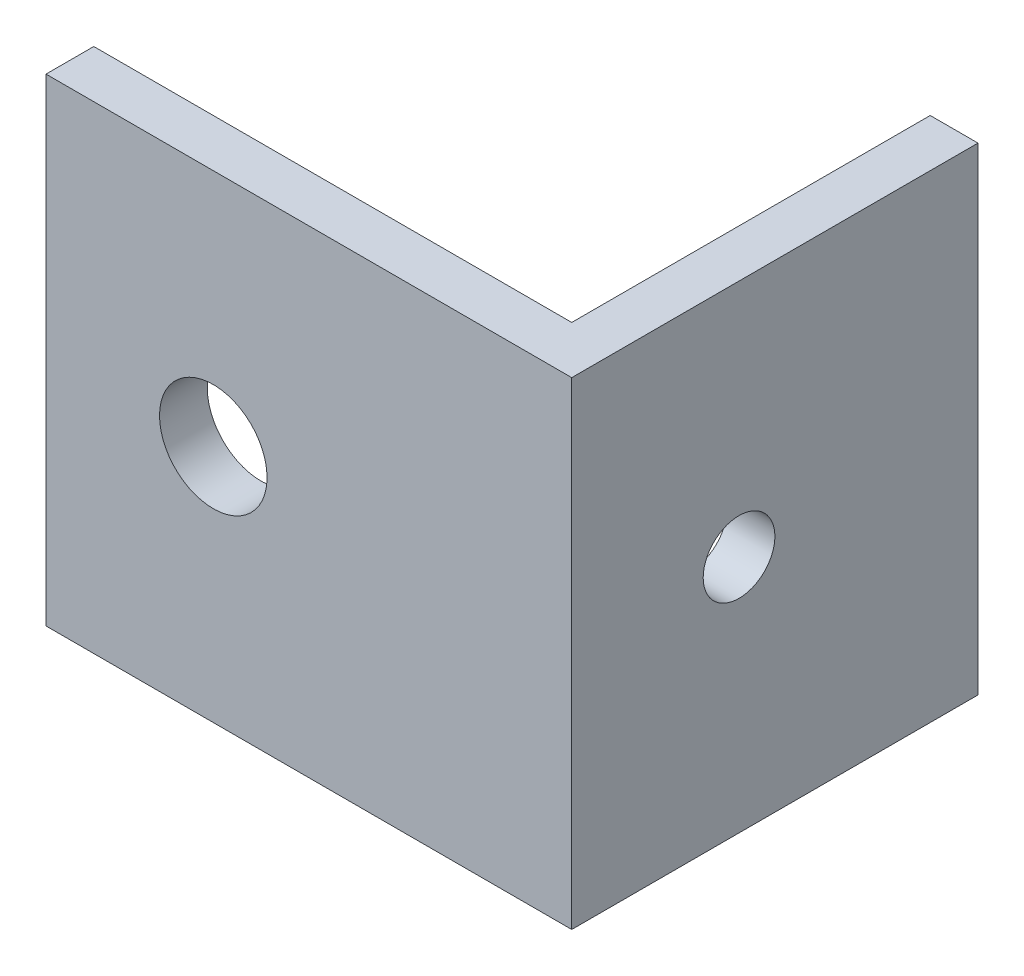
ISO-10303-21;
HEADER;
FILE_DESCRIPTION(('STEP AP214'),'2;1');
FILE_NAME('part.step','',(''),(''),'','','');
FILE_SCHEMA(('AUTOMOTIVE_DESIGN { 1 0 10303 214 1 1 1 1 }'));
ENDSEC;
DATA;
#1=APPLICATION_CONTEXT('core data for automotive mechanical design processes');
#2=APPLICATION_PROTOCOL_DEFINITION('international standard','automotive_design',2000,#1);
#3=PRODUCT_CONTEXT('',#1,'mechanical');
#4=PRODUCT('Part','Part','',(#3));
#5=PRODUCT_RELATED_PRODUCT_CATEGORY('part','',(#4));
#6=PRODUCT_DEFINITION_FORMATION('','',#4);
#7=PRODUCT_DEFINITION_CONTEXT('part definition',#1,'design');
#8=PRODUCT_DEFINITION('design','',#6,#7);
#9=PRODUCT_DEFINITION_SHAPE('','',#8);
#10=(LENGTH_UNIT() NAMED_UNIT(*) SI_UNIT(.MILLI.,.METRE.));
#11=(NAMED_UNIT(*) PLANE_ANGLE_UNIT() SI_UNIT($,.RADIAN.));
#12=(NAMED_UNIT(*) SI_UNIT($,.STERADIAN.) SOLID_ANGLE_UNIT());
#13=UNCERTAINTY_MEASURE_WITH_UNIT(LENGTH_MEASURE(1.E-05),#10,'distance_accuracy_value','');
#14=(GEOMETRIC_REPRESENTATION_CONTEXT(3) GLOBAL_UNCERTAINTY_ASSIGNED_CONTEXT((#13)) GLOBAL_UNIT_ASSIGNED_CONTEXT((#10,
#11,#12)) REPRESENTATION_CONTEXT('',''));
#15=CARTESIAN_POINT('',(0.,0.,0.));
#16=DIRECTION('',(0.,0.,1.));
#17=DIRECTION('',(1.,0.,0.));
#18=AXIS2_PLACEMENT_3D('',#15,#16,#17);
#19=CARTESIAN_POINT('',(-20.,20.,0.));
#20=DIRECTION('',(1.,0.,0.));
#21=DIRECTION('',(0.,0.,-1.));
#22=AXIS2_PLACEMENT_3D('',#19,#20,#21);
#23=PLANE('',#22);
#24=DIRECTION('',(0.,0.,1.));
#25=VECTOR('',#24,1.);
#26=CARTESIAN_POINT('',(-20.,0.,0.));
#27=LINE('',#26,#25);
#28=CARTESIAN_POINT('',(-20.,0.,0.));
#29=VERTEX_POINT('',#28);
#30=CARTESIAN_POINT('',(-20.,0.,2.));
#31=VERTEX_POINT('',#30);
#32=EDGE_CURVE('E119',#29,#31,#27,.T.);
#33=ORIENTED_EDGE('',*,*,#32,.T.);
#34=DIRECTION('',(0.,-1.,0.));
#35=VECTOR('',#34,1.);
#36=CARTESIAN_POINT('',(-20.,20.,2.));
#37=LINE('',#36,#35);
#38=CARTESIAN_POINT('',(-20.,20.,2.));
#39=VERTEX_POINT('',#38);
#40=EDGE_CURVE('E11',#39,#31,#37,.T.);
#41=ORIENTED_EDGE('',*,*,#40,.F.);
#42=DIRECTION('',(0.,0.,1.));
#43=VECTOR('',#42,1.);
#44=CARTESIAN_POINT('',(-20.,20.,0.));
#45=LINE('',#44,#43);
#46=CARTESIAN_POINT('',(-20.,20.,0.));
#47=VERTEX_POINT('',#46);
#48=EDGE_CURVE('E130',#47,#39,#45,.T.);
#49=ORIENTED_EDGE('',*,*,#48,.F.);
#50=DIRECTION('',(0.,-1.,0.));
#51=VECTOR('',#50,1.);
#52=CARTESIAN_POINT('',(-20.,20.,0.));
#53=LINE('',#52,#51);
#54=EDGE_CURVE('E115',#47,#29,#53,.T.);
#55=ORIENTED_EDGE('',*,*,#54,.T.);
#56=EDGE_LOOP('',(#33,#41,#49,#55));
#57=FACE_BOUND('',#56,.T.);
#58=ADVANCED_FACE('F35',(#57),#23,.F.);
#59=CARTESIAN_POINT('',(-20.,20.,2.));
#60=DIRECTION('',(0.,0.,-1.));
#61=DIRECTION('',(-1.,0.,0.));
#62=AXIS2_PLACEMENT_3D('',#59,#60,#61);
#63=PLANE('',#62);
#64=CARTESIAN_POINT('',(-13.,10.,2.));
#65=DIRECTION('',(0.,0.,-1.));
#66=DIRECTION('',(-1.,0.,0.));
#67=AXIS2_PLACEMENT_3D('',#64,#65,#66);
#68=CIRCLE('',#67,2.25);
#69=CARTESIAN_POINT('',(-15.25,10.,2.));
#70=VERTEX_POINT('',#69);
#71=EDGE_CURVE('E123',#70,#70,#68,.T.);
#72=ORIENTED_EDGE('',*,*,#71,.T.);
#73=EDGE_LOOP('',(#72));
#74=FACE_BOUND('',#73,.T.);
#75=DIRECTION('',(1.,0.,0.));
#76=VECTOR('',#75,1.);
#77=CARTESIAN_POINT('',(-20.,0.,2.));
#78=LINE('',#77,#76);
#79=CARTESIAN_POINT('',(2.,0.,2.));
#80=VERTEX_POINT('',#79);
#81=EDGE_CURVE('E122',#31,#80,#78,.T.);
#82=ORIENTED_EDGE('',*,*,#81,.T.);
#83=DIRECTION('',(0.,-1.,0.));
#84=VECTOR('',#83,1.);
#85=CARTESIAN_POINT('',(2.,20.,2.));
#86=LINE('',#85,#84);
#87=CARTESIAN_POINT('',(2.,20.,2.));
#88=VERTEX_POINT('',#87);
#89=EDGE_CURVE('E43',#88,#80,#86,.T.);
#90=ORIENTED_EDGE('',*,*,#89,.F.);
#91=DIRECTION('',(1.,0.,0.));
#92=VECTOR('',#91,1.);
#93=CARTESIAN_POINT('',(-20.,20.,2.));
#94=LINE('',#93,#92);
#95=EDGE_CURVE('E88',#39,#88,#94,.T.);
#96=ORIENTED_EDGE('',*,*,#95,.F.);
#97=ORIENTED_EDGE('',*,*,#40,.T.);
#98=EDGE_LOOP('',(#82,#90,#96,#97));
#99=FACE_BOUND('',#98,.T.);
#100=ADVANCED_FACE('F157',(#74,#99),#63,.F.);
#101=CARTESIAN_POINT('',(2.,20.,2.));
#102=DIRECTION('',(-1.,0.,0.));
#103=DIRECTION('',(0.,0.,1.));
#104=AXIS2_PLACEMENT_3D('',#101,#102,#103);
#105=PLANE('',#104);
#106=CARTESIAN_POINT('',(2.,10.,-5.));
#107=DIRECTION('',(-1.,0.,0.));
#108=DIRECTION('',(0.,0.,1.));
#109=AXIS2_PLACEMENT_3D('',#106,#107,#108);
#110=CIRCLE('',#109,1.5);
#111=CARTESIAN_POINT('',(2.,10.,-3.5));
#112=VERTEX_POINT('',#111);
#113=EDGE_CURVE('E237',#112,#112,#110,.T.);
#114=ORIENTED_EDGE('',*,*,#113,.T.);
#115=EDGE_LOOP('',(#114));
#116=FACE_BOUND('',#115,.T.);
#117=DIRECTION('',(0.,0.,-1.));
#118=VECTOR('',#117,1.);
#119=CARTESIAN_POINT('',(2.,0.,2.));
#120=LINE('',#119,#118);
#121=CARTESIAN_POINT('',(2.,0.,-15.));
#122=VERTEX_POINT('',#121);
#123=EDGE_CURVE('E125',#80,#122,#120,.T.);
#124=ORIENTED_EDGE('',*,*,#123,.T.);
#125=DIRECTION('',(0.,-1.,0.));
#126=VECTOR('',#125,1.);
#127=CARTESIAN_POINT('',(2.,20.,-15.));
#128=LINE('',#127,#126);
#129=CARTESIAN_POINT('',(2.,20.,-15.));
#130=VERTEX_POINT('',#129);
#131=EDGE_CURVE('E110',#130,#122,#128,.T.);
#132=ORIENTED_EDGE('',*,*,#131,.F.);
#133=DIRECTION('',(0.,0.,-1.));
#134=VECTOR('',#133,1.);
#135=CARTESIAN_POINT('',(2.,20.,2.));
#136=LINE('',#135,#134);
#137=EDGE_CURVE('E101',#88,#130,#136,.T.);
#138=ORIENTED_EDGE('',*,*,#137,.F.);
#139=ORIENTED_EDGE('',*,*,#89,.T.);
#140=EDGE_LOOP('',(#124,#132,#138,#139));
#141=FACE_BOUND('',#140,.T.);
#142=ADVANCED_FACE('F136',(#116,#141),#105,.F.);
#143=CARTESIAN_POINT('',(0.,20.,-15.));
#144=DIRECTION('',(0.,0.,1.));
#145=DIRECTION('',(1.,0.,0.));
#146=AXIS2_PLACEMENT_3D('',#143,#144,#145);
#147=PLANE('',#146);
#148=DIRECTION('',(-1.,0.,0.));
#149=VECTOR('',#148,1.);
#150=CARTESIAN_POINT('',(0.,0.,-15.));
#151=LINE('',#150,#149);
#152=CARTESIAN_POINT('',(0.,0.,-15.));
#153=VERTEX_POINT('',#152);
#154=EDGE_CURVE('E109',#122,#153,#151,.T.);
#155=ORIENTED_EDGE('',*,*,#154,.T.);
#156=DIRECTION('',(0.,-1.,0.));
#157=VECTOR('',#156,1.);
#158=CARTESIAN_POINT('',(0.,20.,-15.));
#159=LINE('',#158,#157);
#160=CARTESIAN_POINT('',(0.,20.,-15.));
#161=VERTEX_POINT('',#160);
#162=EDGE_CURVE('E106',#161,#153,#159,.T.);
#163=ORIENTED_EDGE('',*,*,#162,.F.);
#164=DIRECTION('',(-1.,0.,0.));
#165=VECTOR('',#164,1.);
#166=CARTESIAN_POINT('',(0.,20.,-15.));
#167=LINE('',#166,#165);
#168=EDGE_CURVE('E95',#130,#161,#167,.T.);
#169=ORIENTED_EDGE('',*,*,#168,.F.);
#170=ORIENTED_EDGE('',*,*,#131,.T.);
#171=EDGE_LOOP('',(#155,#163,#169,#170));
#172=FACE_BOUND('',#171,.T.);
#173=ADVANCED_FACE('F107',(#172),#147,.F.);
#174=CARTESIAN_POINT('',(0.,20.,0.));
#175=DIRECTION('',(1.,0.,0.));
#176=DIRECTION('',(0.,0.,-1.));
#177=AXIS2_PLACEMENT_3D('',#174,#175,#176);
#178=PLANE('',#177);
#179=CARTESIAN_POINT('',(0.,10.,-5.));
#180=DIRECTION('',(-1.,0.,0.));
#181=DIRECTION('',(0.,0.,1.));
#182=AXIS2_PLACEMENT_3D('',#179,#180,#181);
#183=CIRCLE('',#182,1.5);
#184=CARTESIAN_POINT('',(0.,10.,-3.5));
#185=VERTEX_POINT('',#184);
#186=EDGE_CURVE('E241',#185,#185,#183,.T.);
#187=ORIENTED_EDGE('',*,*,#186,.F.);
#188=EDGE_LOOP('',(#187));
#189=FACE_BOUND('',#188,.T.);
#190=DIRECTION('',(0.,0.,1.));
#191=VECTOR('',#190,1.);
#192=CARTESIAN_POINT('',(0.,0.,0.));
#193=LINE('',#192,#191);
#194=CARTESIAN_POINT('',(0.,0.,0.));
#195=VERTEX_POINT('',#194);
#196=EDGE_CURVE('E74',#153,#195,#193,.T.);
#197=ORIENTED_EDGE('',*,*,#196,.T.);
#198=DIRECTION('',(0.,-1.,0.));
#199=VECTOR('',#198,1.);
#200=CARTESIAN_POINT('',(0.,20.,0.));
#201=LINE('',#200,#199);
#202=CARTESIAN_POINT('',(0.,20.,0.));
#203=VERTEX_POINT('',#202);
#204=EDGE_CURVE('E111',#203,#195,#201,.T.);
#205=ORIENTED_EDGE('',*,*,#204,.F.);
#206=DIRECTION('',(0.,0.,1.));
#207=VECTOR('',#206,1.);
#208=CARTESIAN_POINT('',(0.,20.,0.));
#209=LINE('',#208,#207);
#210=EDGE_CURVE('E99',#161,#203,#209,.T.);
#211=ORIENTED_EDGE('',*,*,#210,.F.);
#212=ORIENTED_EDGE('',*,*,#162,.T.);
#213=EDGE_LOOP('',(#197,#205,#211,#212));
#214=FACE_BOUND('',#213,.T.);
#215=ADVANCED_FACE('F113',(#189,#214),#178,.F.);
#216=CARTESIAN_POINT('',(-20.,20.,0.));
#217=DIRECTION('',(0.,0.,1.));
#218=DIRECTION('',(1.,0.,0.));
#219=AXIS2_PLACEMENT_3D('',#216,#217,#218);
#220=PLANE('',#219);
#221=CARTESIAN_POINT('',(-13.,10.,0.));
#222=DIRECTION('',(0.,0.,-1.));
#223=DIRECTION('',(-1.,0.,0.));
#224=AXIS2_PLACEMENT_3D('',#221,#222,#223);
#225=CIRCLE('',#224,2.25);
#226=CARTESIAN_POINT('',(-15.25,10.,0.));
#227=VERTEX_POINT('',#226);
#228=EDGE_CURVE('E236',#227,#227,#225,.T.);
#229=ORIENTED_EDGE('',*,*,#228,.F.);
#230=EDGE_LOOP('',(#229));
#231=FACE_BOUND('',#230,.T.);
#232=DIRECTION('',(-1.,0.,0.));
#233=VECTOR('',#232,1.);
#234=CARTESIAN_POINT('',(-20.,0.,0.));
#235=LINE('',#234,#233);
#236=EDGE_CURVE('E80',#195,#29,#235,.T.);
#237=ORIENTED_EDGE('',*,*,#236,.T.);
#238=ORIENTED_EDGE('',*,*,#54,.F.);
#239=DIRECTION('',(-1.,0.,0.));
#240=VECTOR('',#239,1.);
#241=CARTESIAN_POINT('',(-20.,20.,0.));
#242=LINE('',#241,#240);
#243=EDGE_CURVE('E51',#203,#47,#242,.T.);
#244=ORIENTED_EDGE('',*,*,#243,.F.);
#245=ORIENTED_EDGE('',*,*,#204,.T.);
#246=EDGE_LOOP('',(#237,#238,#244,#245));
#247=FACE_BOUND('',#246,.T.);
#248=ADVANCED_FACE('F143',(#231,#247),#220,.F.);
#249=CARTESIAN_POINT('',(0.,20.,0.));
#250=DIRECTION('',(0.,1.,0.));
#251=DIRECTION('',(0.,0.,1.));
#252=AXIS2_PLACEMENT_3D('',#249,#250,#251);
#253=PLANE('',#252);
#254=ORIENTED_EDGE('',*,*,#48,.T.);
#255=ORIENTED_EDGE('',*,*,#95,.T.);
#256=ORIENTED_EDGE('',*,*,#137,.T.);
#257=ORIENTED_EDGE('',*,*,#168,.T.);
#258=ORIENTED_EDGE('',*,*,#210,.T.);
#259=ORIENTED_EDGE('',*,*,#243,.T.);
#260=EDGE_LOOP('',(#254,#255,#256,#257,#258,#259));
#261=FACE_BOUND('',#260,.T.);
#262=ADVANCED_FACE('F97',(#261),#253,.T.);
#263=CARTESIAN_POINT('',(0.,0.,0.));
#264=DIRECTION('',(0.,1.,0.));
#265=DIRECTION('',(0.,0.,1.));
#266=AXIS2_PLACEMENT_3D('',#263,#264,#265);
#267=PLANE('',#266);
#268=ORIENTED_EDGE('',*,*,#32,.F.);
#269=ORIENTED_EDGE('',*,*,#236,.F.);
#270=ORIENTED_EDGE('',*,*,#196,.F.);
#271=ORIENTED_EDGE('',*,*,#154,.F.);
#272=ORIENTED_EDGE('',*,*,#123,.F.);
#273=ORIENTED_EDGE('',*,*,#81,.F.);
#274=EDGE_LOOP('',(#268,#269,#270,#271,#272,#273));
#275=FACE_BOUND('',#274,.T.);
#276=ADVANCED_FACE('F139',(#275),#267,.F.);
#277=CARTESIAN_POINT('',(-13.,10.,2.));
#278=DIRECTION('',(0.,0.,-1.));
#279=DIRECTION('',(-1.,0.,0.));
#280=AXIS2_PLACEMENT_3D('',#277,#278,#279);
#281=CYLINDRICAL_SURFACE('',#280,2.25);
#282=ORIENTED_EDGE('',*,*,#71,.F.);
#283=EDGE_LOOP('',(#282));
#284=FACE_BOUND('',#283,.T.);
#285=ORIENTED_EDGE('',*,*,#228,.T.);
#286=EDGE_LOOP('',(#285));
#287=FACE_BOUND('',#286,.T.);
#288=ADVANCED_FACE('F192',(#284,#287),#281,.F.);
#289=CARTESIAN_POINT('',(2.,10.,-5.));
#290=DIRECTION('',(-1.,0.,0.));
#291=DIRECTION('',(0.,0.,1.));
#292=AXIS2_PLACEMENT_3D('',#289,#290,#291);
#293=CYLINDRICAL_SURFACE('',#292,1.5);
#294=ORIENTED_EDGE('',*,*,#113,.F.);
#295=EDGE_LOOP('',(#294));
#296=FACE_BOUND('',#295,.T.);
#297=ORIENTED_EDGE('',*,*,#186,.T.);
#298=EDGE_LOOP('',(#297));
#299=FACE_BOUND('',#298,.T.);
#300=ADVANCED_FACE('F188',(#296,#299),#293,.F.);
#301=CLOSED_SHELL('',(#58,#100,#142,#173,#215,#248,#262,#276,#288,#300));
#302=MANIFOLD_SOLID_BREP('B2',#301);
#303=ADVANCED_BREP_SHAPE_REPRESENTATION('',(#18,#302),#14);
#304=SHAPE_DEFINITION_REPRESENTATION(#9,#303);
ENDSEC;
END-ISO-10303-21;
